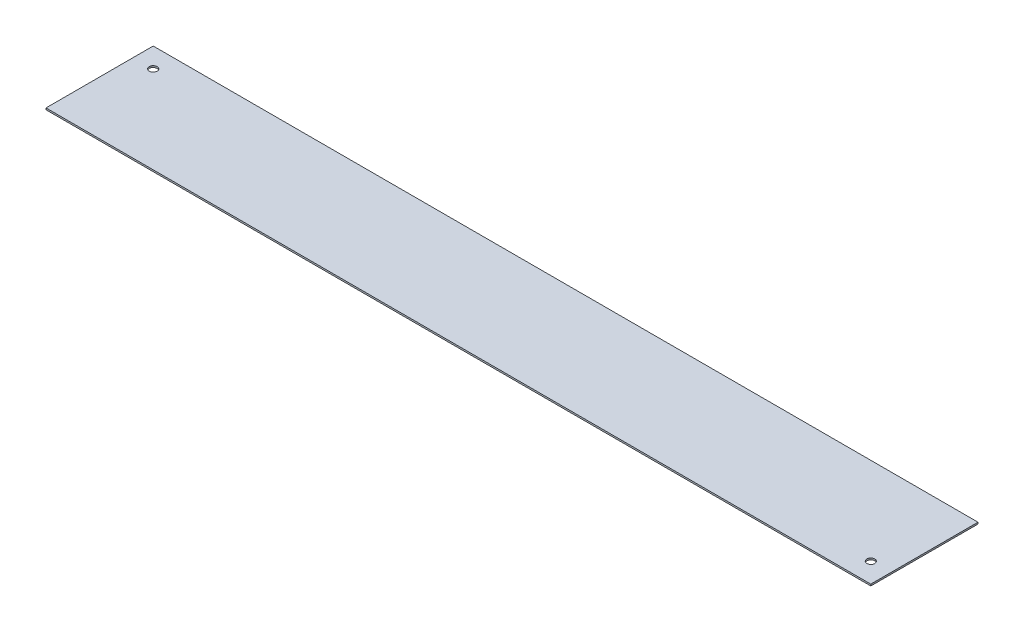
ISO-10303-21;
HEADER;
FILE_DESCRIPTION(('STEP AP214'),'2;1');
FILE_NAME('part.step','',(''),(''),'','','');
FILE_SCHEMA(('AUTOMOTIVE_DESIGN { 1 0 10303 214 1 1 1 1 }'));
ENDSEC;
DATA;
#1=APPLICATION_CONTEXT('core data for automotive mechanical design processes');
#2=APPLICATION_PROTOCOL_DEFINITION('international standard','automotive_design',2000,#1);
#3=PRODUCT_CONTEXT('',#1,'mechanical');
#4=PRODUCT('Part','Part','',(#3));
#5=PRODUCT_RELATED_PRODUCT_CATEGORY('part','',(#4));
#6=PRODUCT_DEFINITION_FORMATION('','',#4);
#7=PRODUCT_DEFINITION_CONTEXT('part definition',#1,'design');
#8=PRODUCT_DEFINITION('design','',#6,#7);
#9=PRODUCT_DEFINITION_SHAPE('','',#8);
#10=(LENGTH_UNIT() NAMED_UNIT(*) SI_UNIT(.MILLI.,.METRE.));
#11=(NAMED_UNIT(*) PLANE_ANGLE_UNIT() SI_UNIT($,.RADIAN.));
#12=(NAMED_UNIT(*) SI_UNIT($,.STERADIAN.) SOLID_ANGLE_UNIT());
#13=UNCERTAINTY_MEASURE_WITH_UNIT(LENGTH_MEASURE(1.E-05),#10,'distance_accuracy_value','');
#14=(GEOMETRIC_REPRESENTATION_CONTEXT(3) GLOBAL_UNCERTAINTY_ASSIGNED_CONTEXT((#13)) GLOBAL_UNIT_ASSIGNED_CONTEXT((#10,
#11,#12)) REPRESENTATION_CONTEXT('',''));
#15=CARTESIAN_POINT('',(0.,0.,0.));
#16=DIRECTION('',(0.,0.,1.));
#17=DIRECTION('',(1.,0.,0.));
#18=AXIS2_PLACEMENT_3D('',#15,#16,#17);
#19=CARTESIAN_POINT('',(-427.555066079295,1.,-35.363436123348));
#20=DIRECTION('',(1.,0.,0.));
#21=DIRECTION('',(0.,0.,-1.));
#22=AXIS2_PLACEMENT_3D('',#19,#20,#21);
#23=PLANE('',#22);
#24=DIRECTION('',(0.,0.,1.));
#25=VECTOR('',#24,1.);
#26=CARTESIAN_POINT('',(-427.555066079295,0.,-35.363436123348));
#27=LINE('',#26,#25);
#28=CARTESIAN_POINT('',(-427.555066079295,0.,-35.363436123348));
#29=VERTEX_POINT('',#28);
#30=CARTESIAN_POINT('',(-427.555066079295,0.,29.636563876652));
#31=VERTEX_POINT('',#30);
#32=EDGE_CURVE('E95',#29,#31,#27,.T.);
#33=ORIENTED_EDGE('',*,*,#32,.T.);
#34=DIRECTION('',(0.,-1.,0.));
#35=VECTOR('',#34,1.);
#36=CARTESIAN_POINT('',(-427.555066079295,1.,29.636563876652));
#37=LINE('',#36,#35);
#38=CARTESIAN_POINT('',(-427.555066079295,1.,29.636563876652));
#39=VERTEX_POINT('',#38);
#40=EDGE_CURVE('E11',#39,#31,#37,.T.);
#41=ORIENTED_EDGE('',*,*,#40,.F.);
#42=DIRECTION('',(0.,0.,1.));
#43=VECTOR('',#42,1.);
#44=CARTESIAN_POINT('',(-427.555066079295,1.,-35.363436123348));
#45=LINE('',#44,#43);
#46=CARTESIAN_POINT('',(-427.555066079295,1.,-35.363436123348));
#47=VERTEX_POINT('',#46);
#48=EDGE_CURVE('E83',#47,#39,#45,.T.);
#49=ORIENTED_EDGE('',*,*,#48,.F.);
#50=DIRECTION('',(0.,-1.,0.));
#51=VECTOR('',#50,1.);
#52=CARTESIAN_POINT('',(-427.555066079295,1.,-35.363436123348));
#53=LINE('',#52,#51);
#54=EDGE_CURVE('E91',#47,#29,#53,.T.);
#55=ORIENTED_EDGE('',*,*,#54,.T.);
#56=EDGE_LOOP('',(#33,#41,#49,#55));
#57=FACE_BOUND('',#56,.T.);
#58=ADVANCED_FACE('F32',(#57),#23,.F.);
#59=CARTESIAN_POINT('',(-427.555066079295,1.,29.636563876652));
#60=DIRECTION('',(0.,0.,-1.));
#61=DIRECTION('',(-1.,0.,0.));
#62=AXIS2_PLACEMENT_3D('',#59,#60,#61);
#63=PLANE('',#62);
#64=DIRECTION('',(1.,0.,0.));
#65=VECTOR('',#64,1.);
#66=CARTESIAN_POINT('',(-427.555066079295,0.,29.636563876652));
#67=LINE('',#66,#65);
#68=CARTESIAN_POINT('',(72.4449339207049,0.,29.636563876652));
#69=VERTEX_POINT('',#68);
#70=EDGE_CURVE('E87',#31,#69,#67,.T.);
#71=ORIENTED_EDGE('',*,*,#70,.T.);
#72=DIRECTION('',(0.,-1.,0.));
#73=VECTOR('',#72,1.);
#74=CARTESIAN_POINT('',(72.4449339207049,1.,29.636563876652));
#75=LINE('',#74,#73);
#76=CARTESIAN_POINT('',(72.4449339207049,1.,29.636563876652));
#77=VERTEX_POINT('',#76);
#78=EDGE_CURVE('E40',#77,#69,#75,.T.);
#79=ORIENTED_EDGE('',*,*,#78,.F.);
#80=DIRECTION('',(1.,0.,0.));
#81=VECTOR('',#80,1.);
#82=CARTESIAN_POINT('',(-427.555066079295,1.,29.636563876652));
#83=LINE('',#82,#81);
#84=EDGE_CURVE('E78',#39,#77,#83,.T.);
#85=ORIENTED_EDGE('',*,*,#84,.F.);
#86=ORIENTED_EDGE('',*,*,#40,.T.);
#87=EDGE_LOOP('',(#71,#79,#85,#86));
#88=FACE_BOUND('',#87,.T.);
#89=ADVANCED_FACE('F86',(#88),#63,.F.);
#90=CARTESIAN_POINT('',(72.4449339207049,1.,-35.363436123348));
#91=DIRECTION('',(-1.,0.,0.));
#92=DIRECTION('',(0.,0.,1.));
#93=AXIS2_PLACEMENT_3D('',#90,#91,#92);
#94=PLANE('',#93);
#95=DIRECTION('',(0.,0.,-1.));
#96=VECTOR('',#95,1.);
#97=CARTESIAN_POINT('',(72.4449339207049,0.,-35.363436123348));
#98=LINE('',#97,#96);
#99=CARTESIAN_POINT('',(72.4449339207049,0.,-35.363436123348));
#100=VERTEX_POINT('',#99);
#101=EDGE_CURVE('E65',#69,#100,#98,.T.);
#102=ORIENTED_EDGE('',*,*,#101,.T.);
#103=DIRECTION('',(0.,-1.,0.));
#104=VECTOR('',#103,1.);
#105=CARTESIAN_POINT('',(72.4449339207049,1.,-35.363436123348));
#106=LINE('',#105,#104);
#107=CARTESIAN_POINT('',(72.4449339207049,1.,-35.363436123348));
#108=VERTEX_POINT('',#107);
#109=EDGE_CURVE('E88',#108,#100,#106,.T.);
#110=ORIENTED_EDGE('',*,*,#109,.F.);
#111=DIRECTION('',(0.,0.,-1.));
#112=VECTOR('',#111,1.);
#113=CARTESIAN_POINT('',(72.4449339207049,1.,-35.363436123348));
#114=LINE('',#113,#112);
#115=EDGE_CURVE('E81',#77,#108,#114,.T.);
#116=ORIENTED_EDGE('',*,*,#115,.F.);
#117=ORIENTED_EDGE('',*,*,#78,.T.);
#118=EDGE_LOOP('',(#102,#110,#116,#117));
#119=FACE_BOUND('',#118,.T.);
#120=ADVANCED_FACE('F89',(#119),#94,.F.);
#121=CARTESIAN_POINT('',(-427.555066079295,1.,-35.363436123348));
#122=DIRECTION('',(0.,0.,1.));
#123=DIRECTION('',(1.,0.,0.));
#124=AXIS2_PLACEMENT_3D('',#121,#122,#123);
#125=PLANE('',#124);
#126=DIRECTION('',(-1.,0.,0.));
#127=VECTOR('',#126,1.);
#128=CARTESIAN_POINT('',(-427.555066079295,0.,-35.363436123348));
#129=LINE('',#128,#127);
#130=EDGE_CURVE('E71',#100,#29,#129,.T.);
#131=ORIENTED_EDGE('',*,*,#130,.T.);
#132=ORIENTED_EDGE('',*,*,#54,.F.);
#133=DIRECTION('',(-1.,0.,0.));
#134=VECTOR('',#133,1.);
#135=CARTESIAN_POINT('',(-427.555066079295,1.,-35.363436123348));
#136=LINE('',#135,#134);
#137=EDGE_CURVE('E48',#108,#47,#136,.T.);
#138=ORIENTED_EDGE('',*,*,#137,.F.);
#139=ORIENTED_EDGE('',*,*,#109,.T.);
#140=EDGE_LOOP('',(#131,#132,#138,#139));
#141=FACE_BOUND('',#140,.T.);
#142=ADVANCED_FACE('F103',(#141),#125,.F.);
#143=CARTESIAN_POINT('',(0.,1.,0.));
#144=DIRECTION('',(0.,1.,0.));
#145=DIRECTION('',(0.,0.,1.));
#146=AXIS2_PLACEMENT_3D('',#143,#144,#145);
#147=PLANE('',#146);
#148=CARTESIAN_POINT('',(-415.555066079295,1.,-23.363436123348));
#149=DIRECTION('',(0.,1.,0.));
#150=DIRECTION('',(0.,0.,1.));
#151=AXIS2_PLACEMENT_3D('',#148,#149,#150);
#152=CIRCLE('',#151,2.40000000000001);
#153=CARTESIAN_POINT('',(-415.555066079295,1.,-20.963436123348));
#154=VERTEX_POINT('',#153);
#155=EDGE_CURVE('E117',#154,#154,#152,.T.);
#156=ORIENTED_EDGE('',*,*,#155,.F.);
#157=EDGE_LOOP('',(#156));
#158=FACE_BOUND('',#157,.T.);
#159=CARTESIAN_POINT('',(60.4449339207049,1.,17.636563876652));
#160=DIRECTION('',(0.,1.,0.));
#161=DIRECTION('',(0.,0.,1.));
#162=AXIS2_PLACEMENT_3D('',#159,#160,#161);
#163=CIRCLE('',#162,2.4);
#164=CARTESIAN_POINT('',(60.4449339207049,1.,20.036563876652));
#165=VERTEX_POINT('',#164);
#166=EDGE_CURVE('E111',#165,#165,#163,.T.);
#167=ORIENTED_EDGE('',*,*,#166,.F.);
#168=EDGE_LOOP('',(#167));
#169=FACE_BOUND('',#168,.T.);
#170=ORIENTED_EDGE('',*,*,#48,.T.);
#171=ORIENTED_EDGE('',*,*,#84,.T.);
#172=ORIENTED_EDGE('',*,*,#115,.T.);
#173=ORIENTED_EDGE('',*,*,#137,.T.);
#174=EDGE_LOOP('',(#170,#171,#172,#173));
#175=FACE_BOUND('',#174,.T.);
#176=ADVANCED_FACE('F79',(#158,#169,#175),#147,.T.);
#177=CARTESIAN_POINT('',(0.,0.,0.));
#178=DIRECTION('',(0.,1.,0.));
#179=DIRECTION('',(0.,0.,1.));
#180=AXIS2_PLACEMENT_3D('',#177,#178,#179);
#181=PLANE('',#180);
#182=CARTESIAN_POINT('',(-415.555066079295,0.,-23.363436123348));
#183=DIRECTION('',(0.,1.,0.));
#184=DIRECTION('',(0.,0.,1.));
#185=AXIS2_PLACEMENT_3D('',#182,#183,#184);
#186=CIRCLE('',#185,2.40000000000001);
#187=CARTESIAN_POINT('',(-415.555066079295,0.,-20.963436123348));
#188=VERTEX_POINT('',#187);
#189=EDGE_CURVE('E114',#188,#188,#186,.T.);
#190=ORIENTED_EDGE('',*,*,#189,.T.);
#191=EDGE_LOOP('',(#190));
#192=FACE_BOUND('',#191,.T.);
#193=CARTESIAN_POINT('',(60.4449339207049,0.,17.636563876652));
#194=DIRECTION('',(0.,1.,0.));
#195=DIRECTION('',(0.,0.,1.));
#196=AXIS2_PLACEMENT_3D('',#193,#194,#195);
#197=CIRCLE('',#196,2.4);
#198=CARTESIAN_POINT('',(60.4449339207049,0.,20.036563876652));
#199=VERTEX_POINT('',#198);
#200=EDGE_CURVE('E98',#199,#199,#197,.T.);
#201=ORIENTED_EDGE('',*,*,#200,.T.);
#202=EDGE_LOOP('',(#201));
#203=FACE_BOUND('',#202,.T.);
#204=ORIENTED_EDGE('',*,*,#32,.F.);
#205=ORIENTED_EDGE('',*,*,#130,.F.);
#206=ORIENTED_EDGE('',*,*,#101,.F.);
#207=ORIENTED_EDGE('',*,*,#70,.F.);
#208=EDGE_LOOP('',(#204,#205,#206,#207));
#209=FACE_BOUND('',#208,.T.);
#210=ADVANCED_FACE('F106',(#192,#203,#209),#181,.F.);
#211=CARTESIAN_POINT('',(60.4449339207049,1.,17.636563876652));
#212=DIRECTION('',(0.,1.,0.));
#213=DIRECTION('',(0.,0.,1.));
#214=AXIS2_PLACEMENT_3D('',#211,#212,#213);
#215=CYLINDRICAL_SURFACE('',#214,2.4);
#216=ORIENTED_EDGE('',*,*,#200,.F.);
#217=EDGE_LOOP('',(#216));
#218=FACE_BOUND('',#217,.T.);
#219=ORIENTED_EDGE('',*,*,#166,.T.);
#220=EDGE_LOOP('',(#219));
#221=FACE_BOUND('',#220,.T.);
#222=ADVANCED_FACE('F128',(#218,#221),#215,.F.);
#223=CARTESIAN_POINT('',(-415.555066079295,1.,-23.363436123348));
#224=DIRECTION('',(0.,1.,0.));
#225=DIRECTION('',(0.,0.,1.));
#226=AXIS2_PLACEMENT_3D('',#223,#224,#225);
#227=CYLINDRICAL_SURFACE('',#226,2.40000000000001);
#228=ORIENTED_EDGE('',*,*,#189,.F.);
#229=EDGE_LOOP('',(#228));
#230=FACE_BOUND('',#229,.T.);
#231=ORIENTED_EDGE('',*,*,#155,.T.);
#232=EDGE_LOOP('',(#231));
#233=FACE_BOUND('',#232,.T.);
#234=ADVANCED_FACE('F121',(#230,#233),#227,.F.);
#235=CLOSED_SHELL('',(#58,#89,#120,#142,#176,#210,#222,#234));
#236=MANIFOLD_SOLID_BREP('B2',#235);
#237=ADVANCED_BREP_SHAPE_REPRESENTATION('',(#18,#236),#14);
#238=SHAPE_DEFINITION_REPRESENTATION(#9,#237);
ENDSEC;
END-ISO-10303-21;
